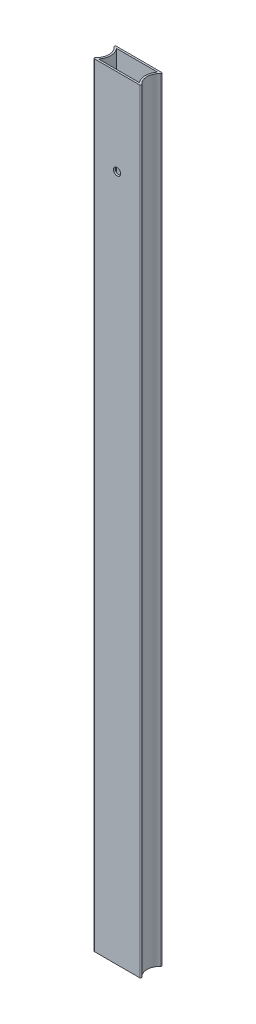
ISO-10303-21;
HEADER;
FILE_DESCRIPTION(('STEP AP214'),'2;1');
FILE_NAME('part.step','',(''),(''),'','','');
FILE_SCHEMA(('AUTOMOTIVE_DESIGN { 1 0 10303 214 1 1 1 1 }'));
ENDSEC;
DATA;
#1=APPLICATION_CONTEXT('core data for automotive mechanical design processes');
#2=APPLICATION_PROTOCOL_DEFINITION('international standard','automotive_design',2000,#1);
#3=PRODUCT_CONTEXT('',#1,'mechanical');
#4=PRODUCT('Part','Part','',(#3));
#5=PRODUCT_RELATED_PRODUCT_CATEGORY('part','',(#4));
#6=PRODUCT_DEFINITION_FORMATION('','',#4);
#7=PRODUCT_DEFINITION_CONTEXT('part definition',#1,'design');
#8=PRODUCT_DEFINITION('design','',#6,#7);
#9=PRODUCT_DEFINITION_SHAPE('','',#8);
#10=(LENGTH_UNIT() NAMED_UNIT(*) SI_UNIT(.MILLI.,.METRE.));
#11=(NAMED_UNIT(*) PLANE_ANGLE_UNIT() SI_UNIT($,.RADIAN.));
#12=(NAMED_UNIT(*) SI_UNIT($,.STERADIAN.) SOLID_ANGLE_UNIT());
#13=UNCERTAINTY_MEASURE_WITH_UNIT(LENGTH_MEASURE(1.E-05),#10,'distance_accuracy_value','');
#14=(GEOMETRIC_REPRESENTATION_CONTEXT(3) GLOBAL_UNCERTAINTY_ASSIGNED_CONTEXT((#13)) GLOBAL_UNIT_ASSIGNED_CONTEXT((#10,
#11,#12)) REPRESENTATION_CONTEXT('',''));
#15=CARTESIAN_POINT('',(0.,0.,0.));
#16=DIRECTION('',(0.,0.,1.));
#17=DIRECTION('',(1.,0.,0.));
#18=AXIS2_PLACEMENT_3D('',#15,#16,#17);
#19=CARTESIAN_POINT('',(-24.8019609728144,850.,-11.));
#20=DIRECTION('',(0.,1.,0.));
#21=DIRECTION('',(0.,0.,1.));
#22=AXIS2_PLACEMENT_3D('',#19,#20,#21);
#23=PLANE('',#22);
#24=CARTESIAN_POINT('',(-24.8019609728144,850.,-11.));
#25=DIRECTION('',(0.,1.,0.));
#26=DIRECTION('',(0.,0.,1.));
#27=AXIS2_PLACEMENT_3D('',#24,#25,#26);
#28=CIRCLE('',#27,0.999999999999999);
#29=CARTESIAN_POINT('',(-24.8019609728144,850.,-12.));
#30=VERTEX_POINT('',#29);
#31=CARTESIAN_POINT('',(-25.4818302412935,850.,-10.2666666666667));
#32=VERTEX_POINT('',#31);
#33=EDGE_CURVE('E159',#30,#32,#28,.T.);
#34=ORIENTED_EDGE('',*,*,#33,.T.);
#35=CARTESIAN_POINT('',(-35.,850.,0.));
#36=DIRECTION('',(0.,-1.,0.));
#37=DIRECTION('',(0.,0.,-1.));
#38=AXIS2_PLACEMENT_3D('',#35,#36,#37);
#39=CIRCLE('',#38,14.);
#40=CARTESIAN_POINT('',(-25.4818302412935,850.,10.2666666666667));
#41=VERTEX_POINT('',#40);
#42=EDGE_CURVE('E162',#32,#41,#39,.T.);
#43=ORIENTED_EDGE('',*,*,#42,.T.);
#44=CARTESIAN_POINT('',(-24.8019609728144,850.,11.));
#45=DIRECTION('',(0.,1.,0.));
#46=DIRECTION('',(0.,0.,1.));
#47=AXIS2_PLACEMENT_3D('',#44,#45,#46);
#48=CIRCLE('',#47,0.999999999999999);
#49=CARTESIAN_POINT('',(-24.8019609728144,850.,12.));
#50=VERTEX_POINT('',#49);
#51=EDGE_CURVE('E165',#41,#50,#48,.T.);
#52=ORIENTED_EDGE('',*,*,#51,.T.);
#53=DIRECTION('',(1.,0.,0.));
#54=VECTOR('',#53,1.);
#55=CARTESIAN_POINT('',(-24.8019609728144,850.,12.));
#56=LINE('',#55,#54);
#57=CARTESIAN_POINT('',(24.8019609728144,850.,12.));
#58=VERTEX_POINT('',#57);
#59=EDGE_CURVE('E167',#50,#58,#56,.T.);
#60=ORIENTED_EDGE('',*,*,#59,.T.);
#61=CARTESIAN_POINT('',(24.8019609728144,850.,11.));
#62=DIRECTION('',(0.,1.,0.));
#63=DIRECTION('',(0.,0.,1.));
#64=AXIS2_PLACEMENT_3D('',#61,#62,#63);
#65=CIRCLE('',#64,0.999999999999999);
#66=CARTESIAN_POINT('',(25.4818302412935,850.,10.2666666666667));
#67=VERTEX_POINT('',#66);
#68=EDGE_CURVE('E169',#58,#67,#65,.T.);
#69=ORIENTED_EDGE('',*,*,#68,.T.);
#70=CARTESIAN_POINT('',(35.,850.,0.));
#71=DIRECTION('',(0.,-1.,0.));
#72=DIRECTION('',(0.,0.,-1.));
#73=AXIS2_PLACEMENT_3D('',#70,#71,#72);
#74=CIRCLE('',#73,14.);
#75=CARTESIAN_POINT('',(25.4818302412935,850.,-10.2666666666667));
#76=VERTEX_POINT('',#75);
#77=EDGE_CURVE('E171',#67,#76,#74,.T.);
#78=ORIENTED_EDGE('',*,*,#77,.T.);
#79=CARTESIAN_POINT('',(24.8019609728144,850.,-11.));
#80=DIRECTION('',(0.,1.,0.));
#81=DIRECTION('',(0.,0.,-1.));
#82=AXIS2_PLACEMENT_3D('',#79,#80,#81);
#83=CIRCLE('',#82,0.999999999999999);
#84=CARTESIAN_POINT('',(24.8019609728144,850.,-12.));
#85=VERTEX_POINT('',#84);
#86=EDGE_CURVE('E173',#76,#85,#83,.T.);
#87=ORIENTED_EDGE('',*,*,#86,.T.);
#88=DIRECTION('',(-1.,0.,0.));
#89=VECTOR('',#88,1.);
#90=CARTESIAN_POINT('',(-24.8019609728144,850.,-12.));
#91=LINE('',#90,#89);
#92=EDGE_CURVE('E175',#85,#30,#91,.T.);
#93=ORIENTED_EDGE('',*,*,#92,.T.);
#94=EDGE_LOOP('',(#34,#43,#52,#60,#69,#78,#87,#93));
#95=FACE_BOUND('',#94,.T.);
#96=DIRECTION('',(-1.,0.,0.));
#97=VECTOR('',#96,1.);
#98=CARTESIAN_POINT('',(-24.8019609728144,850.,-10.));
#99=LINE('',#98,#97);
#100=CARTESIAN_POINT('',(22.5100040032032,850.,-10.));
#101=VERTEX_POINT('',#100);
#102=CARTESIAN_POINT('',(-22.5100040032032,850.,-10.));
#103=VERTEX_POINT('',#102);
#104=EDGE_CURVE('E126',#101,#103,#99,.T.);
#105=ORIENTED_EDGE('',*,*,#104,.F.);
#106=CARTESIAN_POINT('',(35.,850.,0.));
#107=DIRECTION('',(0.,1.,0.));
#108=DIRECTION('',(0.,0.,1.));
#109=AXIS2_PLACEMENT_3D('',#106,#107,#108);
#110=CIRCLE('',#109,16.);
#111=CARTESIAN_POINT('',(22.5100040032032,850.,10.));
#112=VERTEX_POINT('',#111);
#113=EDGE_CURVE('E155',#112,#101,#110,.F.);
#114=ORIENTED_EDGE('',*,*,#113,.F.);
#115=DIRECTION('',(1.,0.,0.));
#116=VECTOR('',#115,1.);
#117=CARTESIAN_POINT('',(-24.8019609728144,850.,10.));
#118=LINE('',#117,#116);
#119=CARTESIAN_POINT('',(-22.5100040032032,850.,10.));
#120=VERTEX_POINT('',#119);
#121=EDGE_CURVE('E148',#120,#112,#118,.T.);
#122=ORIENTED_EDGE('',*,*,#121,.F.);
#123=CARTESIAN_POINT('',(-35.,850.,0.));
#124=DIRECTION('',(0.,1.,0.));
#125=DIRECTION('',(0.,0.,1.));
#126=AXIS2_PLACEMENT_3D('',#123,#124,#125);
#127=CIRCLE('',#126,16.);
#128=EDGE_CURVE('E146',#103,#120,#127,.F.);
#129=ORIENTED_EDGE('',*,*,#128,.F.);
#130=EDGE_LOOP('',(#105,#114,#122,#129));
#131=FACE_BOUND('',#130,.T.);
#132=ADVANCED_FACE('F32',(#95,#131),#23,.T.);
#133=CARTESIAN_POINT('',(-24.8019609728144,850.,-11.));
#134=DIRECTION('',(0.,-1.,0.));
#135=DIRECTION('',(0.,0.,-1.));
#136=AXIS2_PLACEMENT_3D('',#133,#134,#135);
#137=CYLINDRICAL_SURFACE('',#136,0.999999999999999);
#138=CARTESIAN_POINT('',(-24.8019609728144,0.,-11.));
#139=DIRECTION('',(0.,1.,0.));
#140=DIRECTION('',(0.,0.,1.));
#141=AXIS2_PLACEMENT_3D('',#138,#139,#140);
#142=CIRCLE('',#141,0.999999999999999);
#143=CARTESIAN_POINT('',(-24.8019609728144,0.,-12.));
#144=VERTEX_POINT('',#143);
#145=CARTESIAN_POINT('',(-25.4818302412935,0.,-10.2666666666667));
#146=VERTEX_POINT('',#145);
#147=EDGE_CURVE('E129',#144,#146,#142,.T.);
#148=ORIENTED_EDGE('',*,*,#147,.T.);
#149=DIRECTION('',(0.,-1.,0.));
#150=VECTOR('',#149,1.);
#151=CARTESIAN_POINT('',(-25.4818302412935,850.,-10.2666666666667));
#152=LINE('',#151,#150);
#153=EDGE_CURVE('E11',#32,#146,#152,.T.);
#154=ORIENTED_EDGE('',*,*,#153,.F.);
#155=ORIENTED_EDGE('',*,*,#33,.F.);
#156=DIRECTION('',(0.,-1.,0.));
#157=VECTOR('',#156,1.);
#158=CARTESIAN_POINT('',(-24.8019609728144,850.,-12.));
#159=LINE('',#158,#157);
#160=EDGE_CURVE('E177',#30,#144,#159,.T.);
#161=ORIENTED_EDGE('',*,*,#160,.T.);
#162=EDGE_LOOP('',(#148,#154,#155,#161));
#163=FACE_BOUND('',#162,.T.);
#164=ADVANCED_FACE('F34',(#163),#137,.T.);
#165=CARTESIAN_POINT('',(-35.,850.,0.));
#166=DIRECTION('',(0.,-1.,0.));
#167=DIRECTION('',(0.,0.,-1.));
#168=AXIS2_PLACEMENT_3D('',#165,#166,#167);
#169=CYLINDRICAL_SURFACE('',#168,14.);
#170=CARTESIAN_POINT('',(-35.,0.,0.));
#171=DIRECTION('',(0.,-1.,0.));
#172=DIRECTION('',(0.,0.,-1.));
#173=AXIS2_PLACEMENT_3D('',#170,#171,#172);
#174=CIRCLE('',#173,14.);
#175=CARTESIAN_POINT('',(-25.4818302412935,0.,10.2666666666667));
#176=VERTEX_POINT('',#175);
#177=EDGE_CURVE('E180',#146,#176,#174,.T.);
#178=ORIENTED_EDGE('',*,*,#177,.T.);
#179=DIRECTION('',(0.,-1.,0.));
#180=VECTOR('',#179,1.);
#181=CARTESIAN_POINT('',(-25.4818302412935,850.,10.2666666666667));
#182=LINE('',#181,#180);
#183=EDGE_CURVE('E41',#41,#176,#182,.T.);
#184=ORIENTED_EDGE('',*,*,#183,.F.);
#185=ORIENTED_EDGE('',*,*,#42,.F.);
#186=ORIENTED_EDGE('',*,*,#153,.T.);
#187=EDGE_LOOP('',(#178,#184,#185,#186));
#188=FACE_BOUND('',#187,.T.);
#189=ADVANCED_FACE('F236',(#188),#169,.F.);
#190=CARTESIAN_POINT('',(-24.8019609728144,850.,11.));
#191=DIRECTION('',(0.,-1.,0.));
#192=DIRECTION('',(0.,0.,-1.));
#193=AXIS2_PLACEMENT_3D('',#190,#191,#192);
#194=CYLINDRICAL_SURFACE('',#193,0.999999999999999);
#195=CARTESIAN_POINT('',(-24.8019609728144,0.,11.));
#196=DIRECTION('',(0.,1.,0.));
#197=DIRECTION('',(0.,0.,1.));
#198=AXIS2_PLACEMENT_3D('',#195,#196,#197);
#199=CIRCLE('',#198,0.999999999999999);
#200=CARTESIAN_POINT('',(-24.8019609728144,0.,12.));
#201=VERTEX_POINT('',#200);
#202=EDGE_CURVE('E182',#176,#201,#199,.T.);
#203=ORIENTED_EDGE('',*,*,#202,.T.);
#204=DIRECTION('',(0.,-1.,0.));
#205=VECTOR('',#204,1.);
#206=CARTESIAN_POINT('',(-24.8019609728144,850.,12.));
#207=LINE('',#206,#205);
#208=EDGE_CURVE('E207',#50,#201,#207,.T.);
#209=ORIENTED_EDGE('',*,*,#208,.F.);
#210=ORIENTED_EDGE('',*,*,#51,.F.);
#211=ORIENTED_EDGE('',*,*,#183,.T.);
#212=EDGE_LOOP('',(#203,#209,#210,#211));
#213=FACE_BOUND('',#212,.T.);
#214=ADVANCED_FACE('F215',(#213),#194,.T.);
#215=CARTESIAN_POINT('',(-24.8019609728144,850.,12.));
#216=DIRECTION('',(0.,0.,-1.));
#217=DIRECTION('',(-1.,0.,0.));
#218=AXIS2_PLACEMENT_3D('',#215,#216,#217);
#219=PLANE('',#218);
#220=CARTESIAN_POINT('',(0.,755.,12.));
#221=DIRECTION('',(0.,0.,-1.));
#222=DIRECTION('',(-1.,0.,0.));
#223=AXIS2_PLACEMENT_3D('',#220,#221,#222);
#224=CIRCLE('',#223,4.);
#225=CARTESIAN_POINT('',(-4.00000000000001,755.,12.));
#226=VERTEX_POINT('',#225);
#227=EDGE_CURVE('E276',#226,#226,#224,.T.);
#228=ORIENTED_EDGE('',*,*,#227,.T.);
#229=EDGE_LOOP('',(#228));
#230=FACE_BOUND('',#229,.T.);
#231=DIRECTION('',(1.,0.,0.));
#232=VECTOR('',#231,1.);
#233=CARTESIAN_POINT('',(-24.8019609728144,0.,12.));
#234=LINE('',#233,#232);
#235=CARTESIAN_POINT('',(24.8019609728144,0.,12.));
#236=VERTEX_POINT('',#235);
#237=EDGE_CURVE('E184',#201,#236,#234,.T.);
#238=ORIENTED_EDGE('',*,*,#237,.T.);
#239=DIRECTION('',(0.,-1.,0.));
#240=VECTOR('',#239,1.);
#241=CARTESIAN_POINT('',(24.8019609728144,850.,12.));
#242=LINE('',#241,#240);
#243=EDGE_CURVE('E204',#58,#236,#242,.T.);
#244=ORIENTED_EDGE('',*,*,#243,.F.);
#245=ORIENTED_EDGE('',*,*,#59,.F.);
#246=ORIENTED_EDGE('',*,*,#208,.T.);
#247=EDGE_LOOP('',(#238,#244,#245,#246));
#248=FACE_BOUND('',#247,.T.);
#249=ADVANCED_FACE('F224',(#230,#248),#219,.F.);
#250=CARTESIAN_POINT('',(24.8019609728144,850.,11.));
#251=DIRECTION('',(0.,-1.,0.));
#252=DIRECTION('',(0.,0.,-1.));
#253=AXIS2_PLACEMENT_3D('',#250,#251,#252);
#254=CYLINDRICAL_SURFACE('',#253,0.999999999999999);
#255=CARTESIAN_POINT('',(24.8019609728144,0.,11.));
#256=DIRECTION('',(0.,1.,0.));
#257=DIRECTION('',(0.,0.,1.));
#258=AXIS2_PLACEMENT_3D('',#255,#256,#257);
#259=CIRCLE('',#258,0.999999999999999);
#260=CARTESIAN_POINT('',(25.4818302412935,0.,10.2666666666667));
#261=VERTEX_POINT('',#260);
#262=EDGE_CURVE('E186',#236,#261,#259,.T.);
#263=ORIENTED_EDGE('',*,*,#262,.T.);
#264=DIRECTION('',(0.,-1.,0.));
#265=VECTOR('',#264,1.);
#266=CARTESIAN_POINT('',(25.4818302412935,850.,10.2666666666667));
#267=LINE('',#266,#265);
#268=EDGE_CURVE('E201',#67,#261,#267,.T.);
#269=ORIENTED_EDGE('',*,*,#268,.F.);
#270=ORIENTED_EDGE('',*,*,#68,.F.);
#271=ORIENTED_EDGE('',*,*,#243,.T.);
#272=EDGE_LOOP('',(#263,#269,#270,#271));
#273=FACE_BOUND('',#272,.T.);
#274=ADVANCED_FACE('F228',(#273),#254,.T.);
#275=CARTESIAN_POINT('',(35.,850.,0.));
#276=DIRECTION('',(0.,-1.,0.));
#277=DIRECTION('',(0.,0.,-1.));
#278=AXIS2_PLACEMENT_3D('',#275,#276,#277);
#279=CYLINDRICAL_SURFACE('',#278,14.);
#280=CARTESIAN_POINT('',(35.,0.,0.));
#281=DIRECTION('',(0.,-1.,0.));
#282=DIRECTION('',(0.,0.,-1.));
#283=AXIS2_PLACEMENT_3D('',#280,#281,#282);
#284=CIRCLE('',#283,14.);
#285=CARTESIAN_POINT('',(25.4818302412935,0.,-10.2666666666667));
#286=VERTEX_POINT('',#285);
#287=EDGE_CURVE('E188',#261,#286,#284,.T.);
#288=ORIENTED_EDGE('',*,*,#287,.T.);
#289=DIRECTION('',(0.,-1.,0.));
#290=VECTOR('',#289,1.);
#291=CARTESIAN_POINT('',(25.4818302412935,850.,-10.2666666666667));
#292=LINE('',#291,#290);
#293=EDGE_CURVE('E198',#76,#286,#292,.T.);
#294=ORIENTED_EDGE('',*,*,#293,.F.);
#295=ORIENTED_EDGE('',*,*,#77,.F.);
#296=ORIENTED_EDGE('',*,*,#268,.T.);
#297=EDGE_LOOP('',(#288,#294,#295,#296));
#298=FACE_BOUND('',#297,.T.);
#299=ADVANCED_FACE('F249',(#298),#279,.F.);
#300=CARTESIAN_POINT('',(24.8019609728144,850.,-11.));
#301=DIRECTION('',(0.,-1.,0.));
#302=DIRECTION('',(0.,0.,-1.));
#303=AXIS2_PLACEMENT_3D('',#300,#301,#302);
#304=CYLINDRICAL_SURFACE('',#303,0.999999999999999);
#305=CARTESIAN_POINT('',(24.8019609728144,0.,-11.));
#306=DIRECTION('',(0.,1.,0.));
#307=DIRECTION('',(0.,0.,-1.));
#308=AXIS2_PLACEMENT_3D('',#305,#306,#307);
#309=CIRCLE('',#308,0.999999999999999);
#310=CARTESIAN_POINT('',(24.8019609728144,0.,-12.));
#311=VERTEX_POINT('',#310);
#312=EDGE_CURVE('E190',#286,#311,#309,.T.);
#313=ORIENTED_EDGE('',*,*,#312,.T.);
#314=DIRECTION('',(0.,-1.,0.));
#315=VECTOR('',#314,1.);
#316=CARTESIAN_POINT('',(24.8019609728144,850.,-12.));
#317=LINE('',#316,#315);
#318=EDGE_CURVE('E195',#85,#311,#317,.T.);
#319=ORIENTED_EDGE('',*,*,#318,.F.);
#320=ORIENTED_EDGE('',*,*,#86,.F.);
#321=ORIENTED_EDGE('',*,*,#293,.T.);
#322=EDGE_LOOP('',(#313,#319,#320,#321));
#323=FACE_BOUND('',#322,.T.);
#324=ADVANCED_FACE('F247',(#323),#304,.T.);
#325=CARTESIAN_POINT('',(-24.8019609728144,850.,-12.));
#326=DIRECTION('',(0.,0.,1.));
#327=DIRECTION('',(1.,0.,0.));
#328=AXIS2_PLACEMENT_3D('',#325,#326,#327);
#329=PLANE('',#328);
#330=CARTESIAN_POINT('',(0.,755.,-12.));
#331=DIRECTION('',(0.,0.,-1.));
#332=DIRECTION('',(-1.,0.,0.));
#333=AXIS2_PLACEMENT_3D('',#330,#331,#332);
#334=CIRCLE('',#333,4.);
#335=CARTESIAN_POINT('',(-4.00000000000001,755.,-12.));
#336=VERTEX_POINT('',#335);
#337=EDGE_CURVE('E274',#336,#336,#334,.T.);
#338=ORIENTED_EDGE('',*,*,#337,.F.);
#339=EDGE_LOOP('',(#338));
#340=FACE_BOUND('',#339,.T.);
#341=DIRECTION('',(-1.,0.,0.));
#342=VECTOR('',#341,1.);
#343=CARTESIAN_POINT('',(-24.8019609728144,0.,-12.));
#344=LINE('',#343,#342);
#345=EDGE_CURVE('E163',#311,#144,#344,.T.);
#346=ORIENTED_EDGE('',*,*,#345,.T.);
#347=ORIENTED_EDGE('',*,*,#160,.F.);
#348=ORIENTED_EDGE('',*,*,#92,.F.);
#349=ORIENTED_EDGE('',*,*,#318,.T.);
#350=EDGE_LOOP('',(#346,#347,#348,#349));
#351=FACE_BOUND('',#350,.T.);
#352=ADVANCED_FACE('F242',(#340,#351),#329,.F.);
#353=CARTESIAN_POINT('',(-24.8019609728144,0.,-11.));
#354=DIRECTION('',(0.,1.,0.));
#355=DIRECTION('',(0.,0.,1.));
#356=AXIS2_PLACEMENT_3D('',#353,#354,#355);
#357=PLANE('',#356);
#358=DIRECTION('',(-1.,0.,0.));
#359=VECTOR('',#358,1.);
#360=CARTESIAN_POINT('',(-24.8019609728144,0.,-10.));
#361=LINE('',#360,#359);
#362=CARTESIAN_POINT('',(22.5100040032032,0.,-10.));
#363=VERTEX_POINT('',#362);
#364=CARTESIAN_POINT('',(-22.5100040032032,0.,-10.));
#365=VERTEX_POINT('',#364);
#366=EDGE_CURVE('E123',#363,#365,#361,.T.);
#367=ORIENTED_EDGE('',*,*,#366,.T.);
#368=CARTESIAN_POINT('',(-35.,0.,0.));
#369=DIRECTION('',(0.,1.,0.));
#370=DIRECTION('',(0.,0.,1.));
#371=AXIS2_PLACEMENT_3D('',#368,#369,#370);
#372=CIRCLE('',#371,16.);
#373=CARTESIAN_POINT('',(-22.5100040032032,0.,10.));
#374=VERTEX_POINT('',#373);
#375=EDGE_CURVE('E134',#365,#374,#372,.F.);
#376=ORIENTED_EDGE('',*,*,#375,.T.);
#377=DIRECTION('',(1.,0.,0.));
#378=VECTOR('',#377,1.);
#379=CARTESIAN_POINT('',(-24.8019609728144,0.,10.));
#380=LINE('',#379,#378);
#381=CARTESIAN_POINT('',(22.5100040032032,0.,10.));
#382=VERTEX_POINT('',#381);
#383=EDGE_CURVE('E139',#374,#382,#380,.T.);
#384=ORIENTED_EDGE('',*,*,#383,.T.);
#385=CARTESIAN_POINT('',(35.,0.,0.));
#386=DIRECTION('',(0.,1.,0.));
#387=DIRECTION('',(0.,0.,1.));
#388=AXIS2_PLACEMENT_3D('',#385,#386,#387);
#389=CIRCLE('',#388,16.);
#390=EDGE_CURVE('E145',#382,#363,#389,.F.);
#391=ORIENTED_EDGE('',*,*,#390,.T.);
#392=EDGE_LOOP('',(#367,#376,#384,#391));
#393=FACE_BOUND('',#392,.T.);
#394=ORIENTED_EDGE('',*,*,#147,.F.);
#395=ORIENTED_EDGE('',*,*,#345,.F.);
#396=ORIENTED_EDGE('',*,*,#312,.F.);
#397=ORIENTED_EDGE('',*,*,#287,.F.);
#398=ORIENTED_EDGE('',*,*,#262,.F.);
#399=ORIENTED_EDGE('',*,*,#237,.F.);
#400=ORIENTED_EDGE('',*,*,#202,.F.);
#401=ORIENTED_EDGE('',*,*,#177,.F.);
#402=EDGE_LOOP('',(#394,#395,#396,#397,#398,#399,#400,#401));
#403=FACE_BOUND('',#402,.T.);
#404=ADVANCED_FACE('F143',(#393,#403),#357,.F.);
#405=CARTESIAN_POINT('',(-35.,850.,0.));
#406=DIRECTION('',(0.,-1.,0.));
#407=DIRECTION('',(0.,0.,-1.));
#408=AXIS2_PLACEMENT_3D('',#405,#406,#407);
#409=CYLINDRICAL_SURFACE('',#408,16.);
#410=ORIENTED_EDGE('',*,*,#375,.F.);
#411=DIRECTION('',(0.,-1.,0.));
#412=VECTOR('',#411,1.);
#413=CARTESIAN_POINT('',(-22.5100040032032,850.,-10.));
#414=LINE('',#413,#412);
#415=EDGE_CURVE('E118',#103,#365,#414,.T.);
#416=ORIENTED_EDGE('',*,*,#415,.F.);
#417=ORIENTED_EDGE('',*,*,#128,.T.);
#418=DIRECTION('',(0.,-1.,0.));
#419=VECTOR('',#418,1.);
#420=CARTESIAN_POINT('',(-22.5100040032032,850.,10.));
#421=LINE('',#420,#419);
#422=EDGE_CURVE('E130',#120,#374,#421,.T.);
#423=ORIENTED_EDGE('',*,*,#422,.T.);
#424=EDGE_LOOP('',(#410,#416,#417,#423));
#425=FACE_BOUND('',#424,.T.);
#426=ADVANCED_FACE('F135',(#425),#409,.T.);
#427=CARTESIAN_POINT('',(-24.8019609728144,850.,10.));
#428=DIRECTION('',(0.,0.,-1.));
#429=DIRECTION('',(-1.,0.,0.));
#430=AXIS2_PLACEMENT_3D('',#427,#428,#429);
#431=PLANE('',#430);
#432=CARTESIAN_POINT('',(0.,755.,10.));
#433=DIRECTION('',(0.,0.,-1.));
#434=DIRECTION('',(-1.,0.,0.));
#435=AXIS2_PLACEMENT_3D('',#432,#433,#434);
#436=CIRCLE('',#435,4.);
#437=CARTESIAN_POINT('',(-4.00000000000001,755.,10.));
#438=VERTEX_POINT('',#437);
#439=EDGE_CURVE('E140',#438,#438,#436,.T.);
#440=ORIENTED_EDGE('',*,*,#439,.F.);
#441=EDGE_LOOP('',(#440));
#442=FACE_BOUND('',#441,.T.);
#443=ORIENTED_EDGE('',*,*,#383,.F.);
#444=ORIENTED_EDGE('',*,*,#422,.F.);
#445=ORIENTED_EDGE('',*,*,#121,.T.);
#446=DIRECTION('',(0.,-1.,0.));
#447=VECTOR('',#446,1.);
#448=CARTESIAN_POINT('',(22.5100040032032,850.,10.));
#449=LINE('',#448,#447);
#450=EDGE_CURVE('E48',#112,#382,#449,.T.);
#451=ORIENTED_EDGE('',*,*,#450,.T.);
#452=EDGE_LOOP('',(#443,#444,#445,#451));
#453=FACE_BOUND('',#452,.T.);
#454=ADVANCED_FACE('F287',(#442,#453),#431,.T.);
#455=CARTESIAN_POINT('',(35.,850.,0.));
#456=DIRECTION('',(0.,-1.,0.));
#457=DIRECTION('',(0.,0.,-1.));
#458=AXIS2_PLACEMENT_3D('',#455,#456,#457);
#459=CYLINDRICAL_SURFACE('',#458,16.);
#460=ORIENTED_EDGE('',*,*,#390,.F.);
#461=ORIENTED_EDGE('',*,*,#450,.F.);
#462=ORIENTED_EDGE('',*,*,#113,.T.);
#463=DIRECTION('',(0.,-1.,0.));
#464=VECTOR('',#463,1.);
#465=CARTESIAN_POINT('',(22.5100040032032,850.,-10.));
#466=LINE('',#465,#464);
#467=EDGE_CURVE('E158',#101,#363,#466,.T.);
#468=ORIENTED_EDGE('',*,*,#467,.T.);
#469=EDGE_LOOP('',(#460,#461,#462,#468));
#470=FACE_BOUND('',#469,.T.);
#471=ADVANCED_FACE('F284',(#470),#459,.T.);
#472=CARTESIAN_POINT('',(-24.8019609728144,850.,-10.));
#473=DIRECTION('',(0.,0.,1.));
#474=DIRECTION('',(1.,0.,0.));
#475=AXIS2_PLACEMENT_3D('',#472,#473,#474);
#476=PLANE('',#475);
#477=CARTESIAN_POINT('',(0.,755.,-10.));
#478=DIRECTION('',(0.,0.,1.));
#479=DIRECTION('',(1.,0.,0.));
#480=AXIS2_PLACEMENT_3D('',#477,#478,#479);
#481=CIRCLE('',#480,4.);
#482=CARTESIAN_POINT('',(3.99999999999999,755.,-10.));
#483=VERTEX_POINT('',#482);
#484=EDGE_CURVE('E36',#483,#483,#481,.T.);
#485=ORIENTED_EDGE('',*,*,#484,.F.);
#486=EDGE_LOOP('',(#485));
#487=FACE_BOUND('',#486,.T.);
#488=ORIENTED_EDGE('',*,*,#366,.F.);
#489=ORIENTED_EDGE('',*,*,#467,.F.);
#490=ORIENTED_EDGE('',*,*,#104,.T.);
#491=ORIENTED_EDGE('',*,*,#415,.T.);
#492=EDGE_LOOP('',(#488,#489,#490,#491));
#493=FACE_BOUND('',#492,.T.);
#494=ADVANCED_FACE('F120',(#487,#493),#476,.T.);
#495=CARTESIAN_POINT('',(0.,755.,12.));
#496=DIRECTION('',(0.,0.,-1.));
#497=DIRECTION('',(-1.,0.,0.));
#498=AXIS2_PLACEMENT_3D('',#495,#496,#497);
#499=CYLINDRICAL_SURFACE('',#498,4.);
#500=ORIENTED_EDGE('',*,*,#484,.T.);
#501=EDGE_LOOP('',(#500));
#502=FACE_BOUND('',#501,.T.);
#503=ORIENTED_EDGE('',*,*,#337,.T.);
#504=EDGE_LOOP('',(#503));
#505=FACE_BOUND('',#504,.T.);
#506=ADVANCED_FACE('F298',(#502,#505),#499,.F.);
#507=ORIENTED_EDGE('',*,*,#439,.T.);
#508=EDGE_LOOP('',(#507));
#509=FACE_BOUND('',#508,.T.);
#510=ORIENTED_EDGE('',*,*,#227,.F.);
#511=EDGE_LOOP('',(#510));
#512=FACE_BOUND('',#511,.T.);
#513=ADVANCED_FACE('F300',(#509,#512),#499,.F.);
#514=CLOSED_SHELL('',(#132,#164,#189,#214,#249,#274,#299,#324,#352,#404,#426,#454,#471,#494,
#506,#513));
#515=MANIFOLD_SOLID_BREP('B2',#514);
#516=ADVANCED_BREP_SHAPE_REPRESENTATION('',(#18,#515),#14);
#517=SHAPE_DEFINITION_REPRESENTATION(#9,#516);
ENDSEC;
END-ISO-10303-21;
